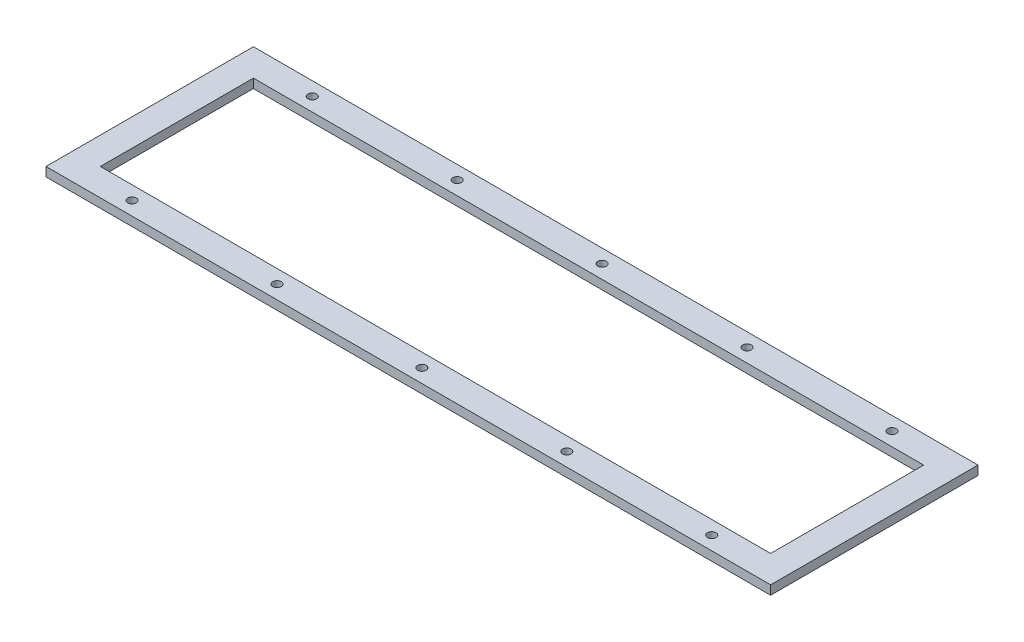
ISO-10303-21;
HEADER;
FILE_DESCRIPTION(('STEP AP214'),'2;1');
FILE_NAME('part.step','',(''),(''),'','','');
FILE_SCHEMA(('AUTOMOTIVE_DESIGN { 1 0 10303 214 1 1 1 1 }'));
ENDSEC;
DATA;
#1=APPLICATION_CONTEXT('core data for automotive mechanical design processes');
#2=APPLICATION_PROTOCOL_DEFINITION('international standard','automotive_design',2000,#1);
#3=PRODUCT_CONTEXT('',#1,'mechanical');
#4=PRODUCT('Part','Part','',(#3));
#5=PRODUCT_RELATED_PRODUCT_CATEGORY('part','',(#4));
#6=PRODUCT_DEFINITION_FORMATION('','',#4);
#7=PRODUCT_DEFINITION_CONTEXT('part definition',#1,'design');
#8=PRODUCT_DEFINITION('design','',#6,#7);
#9=PRODUCT_DEFINITION_SHAPE('','',#8);
#10=(LENGTH_UNIT() NAMED_UNIT(*) SI_UNIT(.MILLI.,.METRE.));
#11=(NAMED_UNIT(*) PLANE_ANGLE_UNIT() SI_UNIT($,.RADIAN.));
#12=(NAMED_UNIT(*) SI_UNIT($,.STERADIAN.) SOLID_ANGLE_UNIT());
#13=UNCERTAINTY_MEASURE_WITH_UNIT(LENGTH_MEASURE(1.E-05),#10,'distance_accuracy_value','');
#14=(GEOMETRIC_REPRESENTATION_CONTEXT(3) GLOBAL_UNCERTAINTY_ASSIGNED_CONTEXT((#13)) GLOBAL_UNIT_ASSIGNED_CONTEXT((#10,
#11,#12)) REPRESENTATION_CONTEXT('',''));
#15=CARTESIAN_POINT('',(0.,0.,0.));
#16=DIRECTION('',(0.,0.,1.));
#17=DIRECTION('',(1.,0.,0.));
#18=AXIS2_PLACEMENT_3D('',#15,#16,#17);
#19=CARTESIAN_POINT('',(0.,-3.175,0.));
#20=DIRECTION('',(0.,-1.,0.));
#21=DIRECTION('',(0.,0.,-1.));
#22=AXIS2_PLACEMENT_3D('',#19,#20,#21);
#23=PLANE('',#22);
#24=CARTESIAN_POINT('',(25.4,-3.175,-4.76249999999848));
#25=DIRECTION('',(0.,1.,0.));
#26=DIRECTION('',(0.,0.,1.));
#27=AXIS2_PLACEMENT_3D('',#24,#25,#26);
#28=CIRCLE('',#27,1.5);
#29=CARTESIAN_POINT('',(25.4,-3.175,-3.26249999999848));
#30=VERTEX_POINT('',#29);
#31=EDGE_CURVE('E545',#30,#30,#28,.T.);
#32=ORIENTED_EDGE('',*,*,#31,.T.);
#33=EDGE_LOOP('',(#32));
#34=FACE_BOUND('',#33,.T.);
#35=CARTESIAN_POINT('',(76.2,-3.175,-4.76249999999848));
#36=DIRECTION('',(0.,1.,0.));
#37=DIRECTION('',(0.,0.,1.));
#38=AXIS2_PLACEMENT_3D('',#35,#36,#37);
#39=CIRCLE('',#38,1.5);
#40=CARTESIAN_POINT('',(76.2,-3.175,-3.26249999999848));
#41=VERTEX_POINT('',#40);
#42=EDGE_CURVE('E553',#41,#41,#39,.T.);
#43=ORIENTED_EDGE('',*,*,#42,.T.);
#44=EDGE_LOOP('',(#43));
#45=FACE_BOUND('',#44,.T.);
#46=CARTESIAN_POINT('',(177.8,-3.175,-4.76249999999842));
#47=DIRECTION('',(0.,-1.,0.));
#48=DIRECTION('',(0.,0.,-1.));
#49=AXIS2_PLACEMENT_3D('',#46,#47,#48);
#50=CIRCLE('',#49,1.5);
#51=CARTESIAN_POINT('',(177.8,-3.175,-6.26249999999842));
#52=VERTEX_POINT('',#51);
#53=EDGE_CURVE('E565',#52,#52,#50,.T.);
#54=ORIENTED_EDGE('',*,*,#53,.F.);
#55=EDGE_LOOP('',(#54));
#56=FACE_BOUND('',#55,.T.);
#57=CARTESIAN_POINT('',(76.2,-3.175,-67.9373799999984));
#58=DIRECTION('',(0.,-1.,0.));
#59=DIRECTION('',(0.,0.,-1.));
#60=AXIS2_PLACEMENT_3D('',#57,#58,#59);
#61=CIRCLE('',#60,1.5);
#62=CARTESIAN_POINT('',(76.2,-3.175,-69.4373799999984));
#63=VERTEX_POINT('',#62);
#64=EDGE_CURVE('E595',#63,#63,#61,.T.);
#65=ORIENTED_EDGE('',*,*,#64,.F.);
#66=EDGE_LOOP('',(#65));
#67=FACE_BOUND('',#66,.T.);
#68=DIRECTION('',(0.,0.,1.));
#69=VECTOR('',#68,1.);
#70=CARTESIAN_POINT('',(244.475,-3.175,-63.1748799999969));
#71=LINE('',#70,#69);
#72=CARTESIAN_POINT('',(244.475,-3.175,-63.1748799999969));
#73=VERTEX_POINT('',#72);
#74=CARTESIAN_POINT('',(244.475,-3.175,-9.52500000000001));
#75=VERTEX_POINT('',#74);
#76=EDGE_CURVE('E284',#73,#75,#71,.T.);
#77=ORIENTED_EDGE('',*,*,#76,.F.);
#78=DIRECTION('',(1.,0.,0.));
#79=VECTOR('',#78,1.);
#80=CARTESIAN_POINT('',(9.525,-3.175,-63.1748799999969));
#81=LINE('',#80,#79);
#82=CARTESIAN_POINT('',(9.525,-3.175,-63.1748799999969));
#83=VERTEX_POINT('',#82);
#84=EDGE_CURVE('E276',#83,#73,#81,.T.);
#85=ORIENTED_EDGE('',*,*,#84,.F.);
#86=DIRECTION('',(0.,0.,1.));
#87=VECTOR('',#86,1.);
#88=CARTESIAN_POINT('',(9.525,-3.175,-63.1748799999969));
#89=LINE('',#88,#87);
#90=CARTESIAN_POINT('',(9.525,-3.175,-9.52500000000001));
#91=VERTEX_POINT('',#90);
#92=EDGE_CURVE('E299',#83,#91,#89,.T.);
#93=ORIENTED_EDGE('',*,*,#92,.T.);
#94=DIRECTION('',(-1.,0.,0.));
#95=VECTOR('',#94,1.);
#96=CARTESIAN_POINT('',(244.475,-3.175,-9.52500000000001));
#97=LINE('',#96,#95);
#98=EDGE_CURVE('E297',#75,#91,#97,.T.);
#99=ORIENTED_EDGE('',*,*,#98,.F.);
#100=EDGE_LOOP('',(#77,#85,#93,#99));
#101=FACE_BOUND('',#100,.T.);
#102=DIRECTION('',(0.,0.,-1.));
#103=VECTOR('',#102,1.);
#104=CARTESIAN_POINT('',(0.,-3.175,0.));
#105=LINE('',#104,#103);
#106=CARTESIAN_POINT('',(0.,-3.175,0.));
#107=VERTEX_POINT('',#106);
#108=CARTESIAN_POINT('',(0.,-3.175,-72.6998799999968));
#109=VERTEX_POINT('',#108);
#110=EDGE_CURVE('E314',#107,#109,#105,.T.);
#111=ORIENTED_EDGE('',*,*,#110,.T.);
#112=DIRECTION('',(1.,0.,0.));
#113=VECTOR('',#112,1.);
#114=CARTESIAN_POINT('',(0.,-3.175,-72.6998799999968));
#115=LINE('',#114,#113);
#116=CARTESIAN_POINT('',(254.,-3.175,-72.6998799999969));
#117=VERTEX_POINT('',#116);
#118=EDGE_CURVE('E317',#109,#117,#115,.T.);
#119=ORIENTED_EDGE('',*,*,#118,.T.);
#120=DIRECTION('',(0.,0.,-1.));
#121=VECTOR('',#120,1.);
#122=CARTESIAN_POINT('',(254.,-3.175,0.));
#123=LINE('',#122,#121);
#124=CARTESIAN_POINT('',(254.,-3.175,0.));
#125=VERTEX_POINT('',#124);
#126=EDGE_CURVE('E320',#125,#117,#123,.T.);
#127=ORIENTED_EDGE('',*,*,#126,.F.);
#128=DIRECTION('',(1.,0.,0.));
#129=VECTOR('',#128,1.);
#130=CARTESIAN_POINT('',(0.,-3.175,0.));
#131=LINE('',#130,#129);
#132=EDGE_CURVE('E323',#107,#125,#131,.T.);
#133=ORIENTED_EDGE('',*,*,#132,.F.);
#134=EDGE_LOOP('',(#111,#119,#127,#133));
#135=FACE_BOUND('',#134,.T.);
#136=CARTESIAN_POINT('',(25.4,-3.175,-67.9373799999984));
#137=DIRECTION('',(0.,-1.,0.));
#138=DIRECTION('',(0.,0.,-1.));
#139=AXIS2_PLACEMENT_3D('',#136,#137,#138);
#140=CIRCLE('',#139,1.5);
#141=CARTESIAN_POINT('',(25.4,-3.175,-69.4373799999984));
#142=VERTEX_POINT('',#141);
#143=EDGE_CURVE('E305',#142,#142,#140,.T.);
#144=ORIENTED_EDGE('',*,*,#143,.F.);
#145=EDGE_LOOP('',(#144));
#146=FACE_BOUND('',#145,.T.);
#147=CARTESIAN_POINT('',(127.,-3.175,-67.9373799999984));
#148=DIRECTION('',(0.,1.,0.));
#149=DIRECTION('',(0.,0.,1.));
#150=AXIS2_PLACEMENT_3D('',#147,#148,#149);
#151=CIRCLE('',#150,1.5);
#152=CARTESIAN_POINT('',(127.,-3.175,-66.4373799999984));
#153=VERTEX_POINT('',#152);
#154=EDGE_CURVE('E589',#153,#153,#151,.T.);
#155=ORIENTED_EDGE('',*,*,#154,.T.);
#156=EDGE_LOOP('',(#155));
#157=FACE_BOUND('',#156,.T.);
#158=CARTESIAN_POINT('',(177.8,-3.175,-67.9373799999984));
#159=DIRECTION('',(0.,1.,0.));
#160=DIRECTION('',(0.,0.,1.));
#161=AXIS2_PLACEMENT_3D('',#158,#159,#160);
#162=CIRCLE('',#161,1.5);
#163=CARTESIAN_POINT('',(177.8,-3.175,-66.4373799999984));
#164=VERTEX_POINT('',#163);
#165=EDGE_CURVE('E583',#164,#164,#162,.T.);
#166=ORIENTED_EDGE('',*,*,#165,.T.);
#167=EDGE_LOOP('',(#166));
#168=FACE_BOUND('',#167,.T.);
#169=CARTESIAN_POINT('',(228.6,-3.175,-67.9373799999984));
#170=DIRECTION('',(0.,1.,0.));
#171=DIRECTION('',(0.,0.,1.));
#172=AXIS2_PLACEMENT_3D('',#169,#170,#171);
#173=CIRCLE('',#172,1.5);
#174=CARTESIAN_POINT('',(228.6,-3.175,-66.4373799999984));
#175=VERTEX_POINT('',#174);
#176=EDGE_CURVE('E577',#175,#175,#173,.T.);
#177=ORIENTED_EDGE('',*,*,#176,.T.);
#178=EDGE_LOOP('',(#177));
#179=FACE_BOUND('',#178,.T.);
#180=CARTESIAN_POINT('',(228.6,-3.175,-4.76249999999842));
#181=DIRECTION('',(0.,-1.,0.));
#182=DIRECTION('',(0.,0.,-1.));
#183=AXIS2_PLACEMENT_3D('',#180,#181,#182);
#184=CIRCLE('',#183,1.5);
#185=CARTESIAN_POINT('',(228.6,-3.175,-6.26249999999842));
#186=VERTEX_POINT('',#185);
#187=EDGE_CURVE('E571',#186,#186,#184,.T.);
#188=ORIENTED_EDGE('',*,*,#187,.F.);
#189=EDGE_LOOP('',(#188));
#190=FACE_BOUND('',#189,.T.);
#191=CARTESIAN_POINT('',(127.,-3.175,-4.76249999999842));
#192=DIRECTION('',(0.,-1.,0.));
#193=DIRECTION('',(0.,0.,-1.));
#194=AXIS2_PLACEMENT_3D('',#191,#192,#193);
#195=CIRCLE('',#194,1.5);
#196=CARTESIAN_POINT('',(127.,-3.175,-6.26249999999842));
#197=VERTEX_POINT('',#196);
#198=EDGE_CURVE('E559',#197,#197,#195,.T.);
#199=ORIENTED_EDGE('',*,*,#198,.F.);
#200=EDGE_LOOP('',(#199));
#201=FACE_BOUND('',#200,.T.);
#202=ADVANCED_FACE('F211',(#34,#45,#56,#67,#101,#135,#146,#157,#168,#179,#190,#201),#23,.T.);
#203=CARTESIAN_POINT('',(0.,0.,0.));
#204=DIRECTION('',(0.,-1.,0.));
#205=DIRECTION('',(0.,0.,-1.));
#206=AXIS2_PLACEMENT_3D('',#203,#204,#205);
#207=PLANE('',#206);
#208=CARTESIAN_POINT('',(25.4,0.,-4.76249999999848));
#209=DIRECTION('',(0.,1.,0.));
#210=DIRECTION('',(0.,0.,1.));
#211=AXIS2_PLACEMENT_3D('',#208,#209,#210);
#212=CIRCLE('',#211,1.5);
#213=CARTESIAN_POINT('',(25.4,0.,-3.26249999999848));
#214=VERTEX_POINT('',#213);
#215=EDGE_CURVE('E548',#214,#214,#212,.T.);
#216=ORIENTED_EDGE('',*,*,#215,.F.);
#217=EDGE_LOOP('',(#216));
#218=FACE_BOUND('',#217,.T.);
#219=CARTESIAN_POINT('',(76.2,0.,-4.76249999999848));
#220=DIRECTION('',(0.,1.,0.));
#221=DIRECTION('',(0.,0.,1.));
#222=AXIS2_PLACEMENT_3D('',#219,#220,#221);
#223=CIRCLE('',#222,1.5);
#224=CARTESIAN_POINT('',(76.2,0.,-3.26249999999848));
#225=VERTEX_POINT('',#224);
#226=EDGE_CURVE('E550',#225,#225,#223,.T.);
#227=ORIENTED_EDGE('',*,*,#226,.F.);
#228=EDGE_LOOP('',(#227));
#229=FACE_BOUND('',#228,.T.);
#230=CARTESIAN_POINT('',(228.6,0.,-67.9373799999984));
#231=DIRECTION('',(0.,1.,0.));
#232=DIRECTION('',(0.,0.,1.));
#233=AXIS2_PLACEMENT_3D('',#230,#231,#232);
#234=CIRCLE('',#233,1.5);
#235=CARTESIAN_POINT('',(228.6,0.,-66.4373799999984));
#236=VERTEX_POINT('',#235);
#237=EDGE_CURVE('E574',#236,#236,#234,.T.);
#238=ORIENTED_EDGE('',*,*,#237,.F.);
#239=EDGE_LOOP('',(#238));
#240=FACE_BOUND('',#239,.T.);
#241=CARTESIAN_POINT('',(177.8,0.,-67.9373799999984));
#242=DIRECTION('',(0.,1.,0.));
#243=DIRECTION('',(0.,0.,1.));
#244=AXIS2_PLACEMENT_3D('',#241,#242,#243);
#245=CIRCLE('',#244,1.5);
#246=CARTESIAN_POINT('',(177.8,0.,-66.4373799999984));
#247=VERTEX_POINT('',#246);
#248=EDGE_CURVE('E580',#247,#247,#245,.T.);
#249=ORIENTED_EDGE('',*,*,#248,.F.);
#250=EDGE_LOOP('',(#249));
#251=FACE_BOUND('',#250,.T.);
#252=CARTESIAN_POINT('',(127.,0.,-67.9373799999984));
#253=DIRECTION('',(0.,1.,0.));
#254=DIRECTION('',(0.,0.,1.));
#255=AXIS2_PLACEMENT_3D('',#252,#253,#254);
#256=CIRCLE('',#255,1.5);
#257=CARTESIAN_POINT('',(127.,0.,-66.4373799999984));
#258=VERTEX_POINT('',#257);
#259=EDGE_CURVE('E586',#258,#258,#256,.T.);
#260=ORIENTED_EDGE('',*,*,#259,.F.);
#261=EDGE_LOOP('',(#260));
#262=FACE_BOUND('',#261,.T.);
#263=DIRECTION('',(0.,0.,-1.));
#264=VECTOR('',#263,1.);
#265=CARTESIAN_POINT('',(0.,0.,0.));
#266=LINE('',#265,#264);
#267=CARTESIAN_POINT('',(0.,0.,0.));
#268=VERTEX_POINT('',#267);
#269=CARTESIAN_POINT('',(0.,0.,-72.6998799999968));
#270=VERTEX_POINT('',#269);
#271=EDGE_CURVE('E292',#268,#270,#266,.T.);
#272=ORIENTED_EDGE('',*,*,#271,.F.);
#273=DIRECTION('',(1.,0.,0.));
#274=VECTOR('',#273,1.);
#275=CARTESIAN_POINT('',(0.,0.,0.));
#276=LINE('',#275,#274);
#277=CARTESIAN_POINT('',(254.,0.,0.));
#278=VERTEX_POINT('',#277);
#279=EDGE_CURVE('E318',#268,#278,#276,.T.);
#280=ORIENTED_EDGE('',*,*,#279,.T.);
#281=DIRECTION('',(0.,0.,-1.));
#282=VECTOR('',#281,1.);
#283=CARTESIAN_POINT('',(254.,0.,0.));
#284=LINE('',#283,#282);
#285=CARTESIAN_POINT('',(254.,0.,-72.6998799999969));
#286=VERTEX_POINT('',#285);
#287=EDGE_CURVE('E332',#278,#286,#284,.T.);
#288=ORIENTED_EDGE('',*,*,#287,.T.);
#289=DIRECTION('',(1.,0.,0.));
#290=VECTOR('',#289,1.);
#291=CARTESIAN_POINT('',(0.,0.,-72.6998799999968));
#292=LINE('',#291,#290);
#293=EDGE_CURVE('E329',#270,#286,#292,.T.);
#294=ORIENTED_EDGE('',*,*,#293,.F.);
#295=EDGE_LOOP('',(#272,#280,#288,#294));
#296=FACE_BOUND('',#295,.T.);
#297=DIRECTION('',(1.,0.,0.));
#298=VECTOR('',#297,1.);
#299=CARTESIAN_POINT('',(9.525,0.,-63.1748799999969));
#300=LINE('',#299,#298);
#301=CARTESIAN_POINT('',(9.525,0.,-63.1748799999969));
#302=VERTEX_POINT('',#301);
#303=CARTESIAN_POINT('',(244.475,0.,-63.1748799999969));
#304=VERTEX_POINT('',#303);
#305=EDGE_CURVE('E234',#302,#304,#300,.T.);
#306=ORIENTED_EDGE('',*,*,#305,.T.);
#307=DIRECTION('',(0.,0.,1.));
#308=VECTOR('',#307,1.);
#309=CARTESIAN_POINT('',(244.475,0.,-63.1748799999969));
#310=LINE('',#309,#308);
#311=CARTESIAN_POINT('',(244.475,0.,-9.52500000000001));
#312=VERTEX_POINT('',#311);
#313=EDGE_CURVE('E291',#304,#312,#310,.T.);
#314=ORIENTED_EDGE('',*,*,#313,.T.);
#315=DIRECTION('',(-1.,0.,0.));
#316=VECTOR('',#315,1.);
#317=CARTESIAN_POINT('',(244.475,0.,-9.52500000000001));
#318=LINE('',#317,#316);
#319=CARTESIAN_POINT('',(9.525,0.,-9.52500000000001));
#320=VERTEX_POINT('',#319);
#321=EDGE_CURVE('E307',#312,#320,#318,.T.);
#322=ORIENTED_EDGE('',*,*,#321,.T.);
#323=DIRECTION('',(0.,0.,1.));
#324=VECTOR('',#323,1.);
#325=CARTESIAN_POINT('',(9.525,0.,-63.1748799999969));
#326=LINE('',#325,#324);
#327=EDGE_CURVE('E285',#302,#320,#326,.T.);
#328=ORIENTED_EDGE('',*,*,#327,.F.);
#329=EDGE_LOOP('',(#306,#314,#322,#328));
#330=FACE_BOUND('',#329,.T.);
#331=CARTESIAN_POINT('',(25.4,0.,-67.9373799999984));
#332=DIRECTION('',(0.,-1.,0.));
#333=DIRECTION('',(0.,0.,-1.));
#334=AXIS2_PLACEMENT_3D('',#331,#332,#333);
#335=CIRCLE('',#334,1.5);
#336=CARTESIAN_POINT('',(25.4,0.,-69.4373799999984));
#337=VERTEX_POINT('',#336);
#338=EDGE_CURVE('E598',#337,#337,#335,.T.);
#339=ORIENTED_EDGE('',*,*,#338,.T.);
#340=EDGE_LOOP('',(#339));
#341=FACE_BOUND('',#340,.T.);
#342=CARTESIAN_POINT('',(76.2,0.,-67.9373799999984));
#343=DIRECTION('',(0.,-1.,0.));
#344=DIRECTION('',(0.,0.,-1.));
#345=AXIS2_PLACEMENT_3D('',#342,#343,#344);
#346=CIRCLE('',#345,1.5);
#347=CARTESIAN_POINT('',(76.2,0.,-69.4373799999984));
#348=VERTEX_POINT('',#347);
#349=EDGE_CURVE('E592',#348,#348,#346,.T.);
#350=ORIENTED_EDGE('',*,*,#349,.T.);
#351=EDGE_LOOP('',(#350));
#352=FACE_BOUND('',#351,.T.);
#353=CARTESIAN_POINT('',(228.6,0.,-4.76249999999842));
#354=DIRECTION('',(0.,-1.,0.));
#355=DIRECTION('',(0.,0.,-1.));
#356=AXIS2_PLACEMENT_3D('',#353,#354,#355);
#357=CIRCLE('',#356,1.5);
#358=CARTESIAN_POINT('',(228.6,0.,-6.26249999999842));
#359=VERTEX_POINT('',#358);
#360=EDGE_CURVE('E568',#359,#359,#357,.T.);
#361=ORIENTED_EDGE('',*,*,#360,.T.);
#362=EDGE_LOOP('',(#361));
#363=FACE_BOUND('',#362,.T.);
#364=CARTESIAN_POINT('',(177.8,0.,-4.76249999999842));
#365=DIRECTION('',(0.,-1.,0.));
#366=DIRECTION('',(0.,0.,-1.));
#367=AXIS2_PLACEMENT_3D('',#364,#365,#366);
#368=CIRCLE('',#367,1.5);
#369=CARTESIAN_POINT('',(177.8,0.,-6.26249999999842));
#370=VERTEX_POINT('',#369);
#371=EDGE_CURVE('E562',#370,#370,#368,.T.);
#372=ORIENTED_EDGE('',*,*,#371,.T.);
#373=EDGE_LOOP('',(#372));
#374=FACE_BOUND('',#373,.T.);
#375=CARTESIAN_POINT('',(127.,0.,-4.76249999999842));
#376=DIRECTION('',(0.,-1.,0.));
#377=DIRECTION('',(0.,0.,-1.));
#378=AXIS2_PLACEMENT_3D('',#375,#376,#377);
#379=CIRCLE('',#378,1.5);
#380=CARTESIAN_POINT('',(127.,0.,-6.26249999999842));
#381=VERTEX_POINT('',#380);
#382=EDGE_CURVE('E556',#381,#381,#379,.T.);
#383=ORIENTED_EDGE('',*,*,#382,.T.);
#384=EDGE_LOOP('',(#383));
#385=FACE_BOUND('',#384,.T.);
#386=ADVANCED_FACE('F349',(#218,#229,#240,#251,#262,#296,#330,#341,#352,#363,#374,#385),#207,.F.);
#387=CARTESIAN_POINT('',(0.,-3.175,0.));
#388=DIRECTION('',(1.,0.,0.));
#389=DIRECTION('',(0.,0.,-1.));
#390=AXIS2_PLACEMENT_3D('',#387,#388,#389);
#391=PLANE('',#390);
#392=ORIENTED_EDGE('',*,*,#271,.T.);
#393=DIRECTION('',(0.,1.,0.));
#394=VECTOR('',#393,1.);
#395=CARTESIAN_POINT('',(0.,-3.175,-72.6998799999968));
#396=LINE('',#395,#394);
#397=EDGE_CURVE('E12',#109,#270,#396,.T.);
#398=ORIENTED_EDGE('',*,*,#397,.F.);
#399=ORIENTED_EDGE('',*,*,#110,.F.);
#400=DIRECTION('',(0.,1.,0.));
#401=VECTOR('',#400,1.);
#402=CARTESIAN_POINT('',(0.,-3.175,0.));
#403=LINE('',#402,#401);
#404=EDGE_CURVE('E326',#107,#268,#403,.T.);
#405=ORIENTED_EDGE('',*,*,#404,.T.);
#406=EDGE_LOOP('',(#392,#398,#399,#405));
#407=FACE_BOUND('',#406,.T.);
#408=ADVANCED_FACE('F213',(#407),#391,.F.);
#409=CARTESIAN_POINT('',(0.,-3.175,-72.6998799999968));
#410=DIRECTION('',(0.,0.,1.));
#411=DIRECTION('',(1.,0.,0.));
#412=AXIS2_PLACEMENT_3D('',#409,#410,#411);
#413=PLANE('',#412);
#414=ORIENTED_EDGE('',*,*,#293,.T.);
#415=DIRECTION('',(0.,1.,0.));
#416=VECTOR('',#415,1.);
#417=CARTESIAN_POINT('',(254.,-3.175,-72.6998799999969));
#418=LINE('',#417,#416);
#419=EDGE_CURVE('E219',#117,#286,#418,.T.);
#420=ORIENTED_EDGE('',*,*,#419,.F.);
#421=ORIENTED_EDGE('',*,*,#118,.F.);
#422=ORIENTED_EDGE('',*,*,#397,.T.);
#423=EDGE_LOOP('',(#414,#420,#421,#422));
#424=FACE_BOUND('',#423,.T.);
#425=ADVANCED_FACE('F345',(#424),#413,.F.);
#426=CARTESIAN_POINT('',(254.,-3.175,0.));
#427=DIRECTION('',(1.,0.,0.));
#428=DIRECTION('',(0.,0.,-1.));
#429=AXIS2_PLACEMENT_3D('',#426,#427,#428);
#430=PLANE('',#429);
#431=ORIENTED_EDGE('',*,*,#287,.F.);
#432=DIRECTION('',(0.,1.,0.));
#433=VECTOR('',#432,1.);
#434=CARTESIAN_POINT('',(254.,-3.175,0.));
#435=LINE('',#434,#433);
#436=EDGE_CURVE('E338',#125,#278,#435,.T.);
#437=ORIENTED_EDGE('',*,*,#436,.F.);
#438=ORIENTED_EDGE('',*,*,#126,.T.);
#439=ORIENTED_EDGE('',*,*,#419,.T.);
#440=EDGE_LOOP('',(#431,#437,#438,#439));
#441=FACE_BOUND('',#440,.T.);
#442=ADVANCED_FACE('F342',(#441),#430,.T.);
#443=CARTESIAN_POINT('',(0.,-3.175,0.));
#444=DIRECTION('',(0.,0.,1.));
#445=DIRECTION('',(1.,0.,0.));
#446=AXIS2_PLACEMENT_3D('',#443,#444,#445);
#447=PLANE('',#446);
#448=ORIENTED_EDGE('',*,*,#279,.F.);
#449=ORIENTED_EDGE('',*,*,#404,.F.);
#450=ORIENTED_EDGE('',*,*,#132,.T.);
#451=ORIENTED_EDGE('',*,*,#436,.T.);
#452=EDGE_LOOP('',(#448,#449,#450,#451));
#453=FACE_BOUND('',#452,.T.);
#454=ADVANCED_FACE('F353',(#453),#447,.T.);
#455=CARTESIAN_POINT('',(9.525,-3.175,-63.1748799999969));
#456=DIRECTION('',(0.,0.,1.));
#457=DIRECTION('',(1.,0.,0.));
#458=AXIS2_PLACEMENT_3D('',#455,#456,#457);
#459=PLANE('',#458);
#460=ORIENTED_EDGE('',*,*,#305,.F.);
#461=DIRECTION('',(0.,1.,0.));
#462=VECTOR('',#461,1.);
#463=CARTESIAN_POINT('',(9.525,-3.175,-63.1748799999969));
#464=LINE('',#463,#462);
#465=EDGE_CURVE('E280',#83,#302,#464,.T.);
#466=ORIENTED_EDGE('',*,*,#465,.F.);
#467=ORIENTED_EDGE('',*,*,#84,.T.);
#468=DIRECTION('',(0.,1.,0.));
#469=VECTOR('',#468,1.);
#470=CARTESIAN_POINT('',(244.475,-3.175,-63.1748799999969));
#471=LINE('',#470,#469);
#472=EDGE_CURVE('E279',#73,#304,#471,.T.);
#473=ORIENTED_EDGE('',*,*,#472,.T.);
#474=EDGE_LOOP('',(#460,#466,#467,#473));
#475=FACE_BOUND('',#474,.T.);
#476=ADVANCED_FACE('F278',(#475),#459,.T.);
#477=CARTESIAN_POINT('',(244.475,-3.175,-63.1748799999969));
#478=DIRECTION('',(-1.,0.,0.));
#479=DIRECTION('',(0.,0.,1.));
#480=AXIS2_PLACEMENT_3D('',#477,#478,#479);
#481=PLANE('',#480);
#482=ORIENTED_EDGE('',*,*,#313,.F.);
#483=ORIENTED_EDGE('',*,*,#472,.F.);
#484=ORIENTED_EDGE('',*,*,#76,.T.);
#485=DIRECTION('',(0.,1.,0.));
#486=VECTOR('',#485,1.);
#487=CARTESIAN_POINT('',(244.475,-3.175,-9.52500000000001));
#488=LINE('',#487,#486);
#489=EDGE_CURVE('E293',#75,#312,#488,.T.);
#490=ORIENTED_EDGE('',*,*,#489,.T.);
#491=EDGE_LOOP('',(#482,#483,#484,#490));
#492=FACE_BOUND('',#491,.T.);
#493=ADVANCED_FACE('F288',(#492),#481,.T.);
#494=CARTESIAN_POINT('',(244.475,-3.175,-9.52500000000001));
#495=DIRECTION('',(0.,0.,-1.));
#496=DIRECTION('',(-1.,0.,0.));
#497=AXIS2_PLACEMENT_3D('',#494,#495,#496);
#498=PLANE('',#497);
#499=ORIENTED_EDGE('',*,*,#321,.F.);
#500=ORIENTED_EDGE('',*,*,#489,.F.);
#501=ORIENTED_EDGE('',*,*,#98,.T.);
#502=DIRECTION('',(0.,1.,0.));
#503=VECTOR('',#502,1.);
#504=CARTESIAN_POINT('',(9.525,-3.175,-9.52500000000001));
#505=LINE('',#504,#503);
#506=EDGE_CURVE('E226',#91,#320,#505,.T.);
#507=ORIENTED_EDGE('',*,*,#506,.T.);
#508=EDGE_LOOP('',(#499,#500,#501,#507));
#509=FACE_BOUND('',#508,.T.);
#510=ADVANCED_FACE('F397',(#509),#498,.T.);
#511=CARTESIAN_POINT('',(9.525,-3.175,-63.1748799999969));
#512=DIRECTION('',(-1.,0.,0.));
#513=DIRECTION('',(0.,0.,1.));
#514=AXIS2_PLACEMENT_3D('',#511,#512,#513);
#515=PLANE('',#514);
#516=ORIENTED_EDGE('',*,*,#327,.T.);
#517=ORIENTED_EDGE('',*,*,#506,.F.);
#518=ORIENTED_EDGE('',*,*,#92,.F.);
#519=ORIENTED_EDGE('',*,*,#465,.T.);
#520=EDGE_LOOP('',(#516,#517,#518,#519));
#521=FACE_BOUND('',#520,.T.);
#522=ADVANCED_FACE('F403',(#521),#515,.F.);
#523=CARTESIAN_POINT('',(25.4,-3.175,-67.9373799999984));
#524=DIRECTION('',(0.,1.,0.));
#525=DIRECTION('',(0.,0.,1.));
#526=AXIS2_PLACEMENT_3D('',#523,#524,#525);
#527=CYLINDRICAL_SURFACE('',#526,1.5);
#528=ORIENTED_EDGE('',*,*,#143,.T.);
#529=EDGE_LOOP('',(#528));
#530=FACE_BOUND('',#529,.T.);
#531=ORIENTED_EDGE('',*,*,#338,.F.);
#532=EDGE_LOOP('',(#531));
#533=FACE_BOUND('',#532,.T.);
#534=ADVANCED_FACE('F411',(#530,#533),#527,.F.);
#535=CARTESIAN_POINT('',(76.2,-3.175,-67.9373799999984));
#536=DIRECTION('',(0.,1.,0.));
#537=DIRECTION('',(0.,0.,1.));
#538=AXIS2_PLACEMENT_3D('',#535,#536,#537);
#539=CYLINDRICAL_SURFACE('',#538,1.5);
#540=ORIENTED_EDGE('',*,*,#64,.T.);
#541=EDGE_LOOP('',(#540));
#542=FACE_BOUND('',#541,.T.);
#543=ORIENTED_EDGE('',*,*,#349,.F.);
#544=EDGE_LOOP('',(#543));
#545=FACE_BOUND('',#544,.T.);
#546=ADVANCED_FACE('F418',(#542,#545),#539,.F.);
#547=CARTESIAN_POINT('',(127.,-3.175,-67.9373799999984));
#548=DIRECTION('',(0.,1.,0.));
#549=DIRECTION('',(0.,0.,1.));
#550=AXIS2_PLACEMENT_3D('',#547,#548,#549);
#551=CYLINDRICAL_SURFACE('',#550,1.5);
#552=ORIENTED_EDGE('',*,*,#154,.F.);
#553=EDGE_LOOP('',(#552));
#554=FACE_BOUND('',#553,.T.);
#555=ORIENTED_EDGE('',*,*,#259,.T.);
#556=EDGE_LOOP('',(#555));
#557=FACE_BOUND('',#556,.T.);
#558=ADVANCED_FACE('F426',(#554,#557),#551,.F.);
#559=CARTESIAN_POINT('',(177.8,-3.175,-67.9373799999984));
#560=DIRECTION('',(0.,1.,0.));
#561=DIRECTION('',(0.,0.,1.));
#562=AXIS2_PLACEMENT_3D('',#559,#560,#561);
#563=CYLINDRICAL_SURFACE('',#562,1.5);
#564=ORIENTED_EDGE('',*,*,#165,.F.);
#565=EDGE_LOOP('',(#564));
#566=FACE_BOUND('',#565,.T.);
#567=ORIENTED_EDGE('',*,*,#248,.T.);
#568=EDGE_LOOP('',(#567));
#569=FACE_BOUND('',#568,.T.);
#570=ADVANCED_FACE('F434',(#566,#569),#563,.F.);
#571=CARTESIAN_POINT('',(228.6,-3.175,-67.9373799999984));
#572=DIRECTION('',(0.,1.,0.));
#573=DIRECTION('',(0.,0.,1.));
#574=AXIS2_PLACEMENT_3D('',#571,#572,#573);
#575=CYLINDRICAL_SURFACE('',#574,1.5);
#576=ORIENTED_EDGE('',*,*,#176,.F.);
#577=EDGE_LOOP('',(#576));
#578=FACE_BOUND('',#577,.T.);
#579=ORIENTED_EDGE('',*,*,#237,.T.);
#580=EDGE_LOOP('',(#579));
#581=FACE_BOUND('',#580,.T.);
#582=ADVANCED_FACE('F442',(#578,#581),#575,.F.);
#583=CARTESIAN_POINT('',(228.6,-3.175,-4.76249999999842));
#584=DIRECTION('',(0.,1.,0.));
#585=DIRECTION('',(0.,0.,1.));
#586=AXIS2_PLACEMENT_3D('',#583,#584,#585);
#587=CYLINDRICAL_SURFACE('',#586,1.5);
#588=ORIENTED_EDGE('',*,*,#187,.T.);
#589=EDGE_LOOP('',(#588));
#590=FACE_BOUND('',#589,.T.);
#591=ORIENTED_EDGE('',*,*,#360,.F.);
#592=EDGE_LOOP('',(#591));
#593=FACE_BOUND('',#592,.T.);
#594=ADVANCED_FACE('F450',(#590,#593),#587,.F.);
#595=CARTESIAN_POINT('',(177.8,-3.175,-4.76249999999842));
#596=DIRECTION('',(0.,1.,0.));
#597=DIRECTION('',(0.,0.,1.));
#598=AXIS2_PLACEMENT_3D('',#595,#596,#597);
#599=CYLINDRICAL_SURFACE('',#598,1.5);
#600=ORIENTED_EDGE('',*,*,#53,.T.);
#601=EDGE_LOOP('',(#600));
#602=FACE_BOUND('',#601,.T.);
#603=ORIENTED_EDGE('',*,*,#371,.F.);
#604=EDGE_LOOP('',(#603));
#605=FACE_BOUND('',#604,.T.);
#606=ADVANCED_FACE('F458',(#602,#605),#599,.F.);
#607=CARTESIAN_POINT('',(127.,-3.175,-4.76249999999842));
#608=DIRECTION('',(0.,1.,0.));
#609=DIRECTION('',(0.,0.,1.));
#610=AXIS2_PLACEMENT_3D('',#607,#608,#609);
#611=CYLINDRICAL_SURFACE('',#610,1.5);
#612=ORIENTED_EDGE('',*,*,#198,.T.);
#613=EDGE_LOOP('',(#612));
#614=FACE_BOUND('',#613,.T.);
#615=ORIENTED_EDGE('',*,*,#382,.F.);
#616=EDGE_LOOP('',(#615));
#617=FACE_BOUND('',#616,.T.);
#618=ADVANCED_FACE('F466',(#614,#617),#611,.F.);
#619=CARTESIAN_POINT('',(76.2,-3.175,-4.76249999999848));
#620=DIRECTION('',(0.,1.,0.));
#621=DIRECTION('',(0.,0.,1.));
#622=AXIS2_PLACEMENT_3D('',#619,#620,#621);
#623=CYLINDRICAL_SURFACE('',#622,1.5);
#624=ORIENTED_EDGE('',*,*,#42,.F.);
#625=EDGE_LOOP('',(#624));
#626=FACE_BOUND('',#625,.T.);
#627=ORIENTED_EDGE('',*,*,#226,.T.);
#628=EDGE_LOOP('',(#627));
#629=FACE_BOUND('',#628,.T.);
#630=ADVANCED_FACE('F474',(#626,#629),#623,.F.);
#631=CARTESIAN_POINT('',(25.4,-3.175,-4.76249999999848));
#632=DIRECTION('',(0.,1.,0.));
#633=DIRECTION('',(0.,0.,1.));
#634=AXIS2_PLACEMENT_3D('',#631,#632,#633);
#635=CYLINDRICAL_SURFACE('',#634,1.5);
#636=ORIENTED_EDGE('',*,*,#31,.F.);
#637=EDGE_LOOP('',(#636));
#638=FACE_BOUND('',#637,.T.);
#639=ORIENTED_EDGE('',*,*,#215,.T.);
#640=EDGE_LOOP('',(#639));
#641=FACE_BOUND('',#640,.T.);
#642=ADVANCED_FACE('F482',(#638,#641),#635,.F.);
#643=CLOSED_SHELL('',(#202,#386,#408,#425,#442,#454,#476,#493,#510,#522,#534,#546,#558,#570,
#582,#594,#606,#618,#630,#642));
#644=MANIFOLD_SOLID_BREP('B2',#643);
#645=ADVANCED_BREP_SHAPE_REPRESENTATION('',(#18,#644),#14);
#646=SHAPE_DEFINITION_REPRESENTATION(#9,#645);
ENDSEC;
END-ISO-10303-21;
